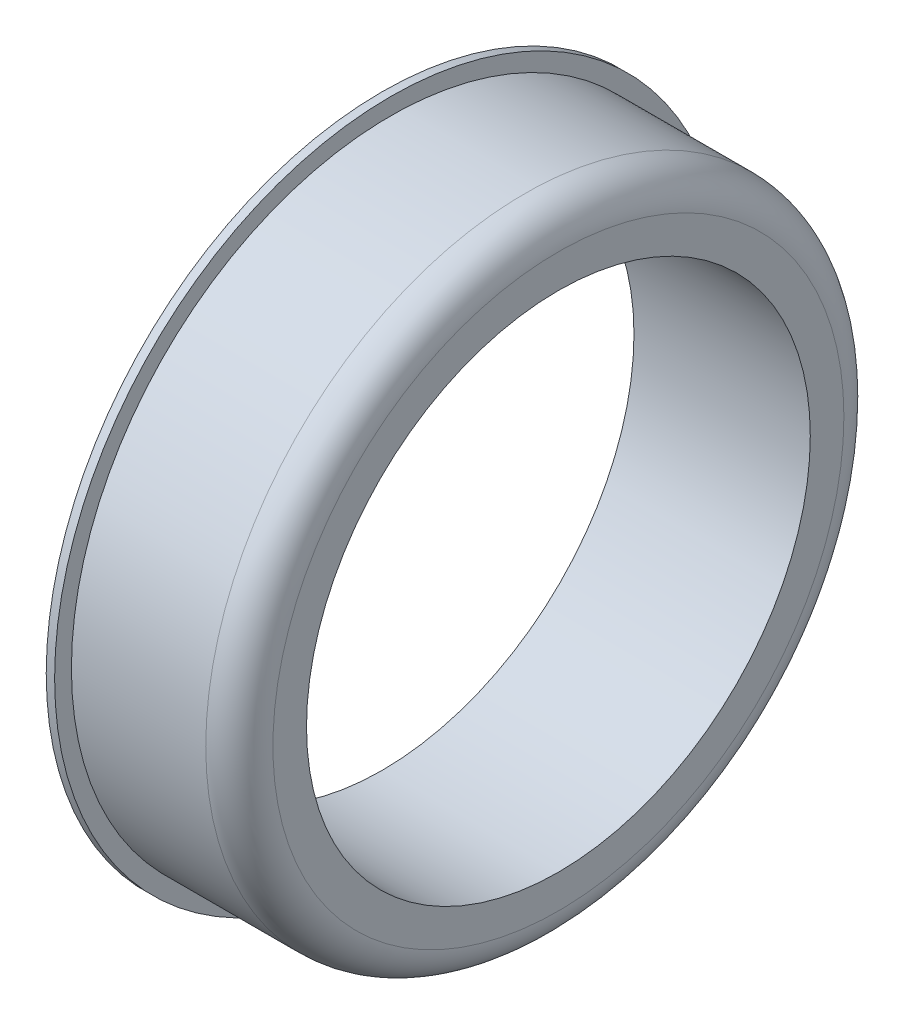
ISO-10303-21;
HEADER;
FILE_DESCRIPTION(('STEP AP214'),'2;1');
FILE_NAME('part.step','',(''),(''),'','','');
FILE_SCHEMA(('AUTOMOTIVE_DESIGN { 1 0 10303 214 1 1 1 1 }'));
ENDSEC;
DATA;
#1=APPLICATION_CONTEXT('core data for automotive mechanical design processes');
#2=APPLICATION_PROTOCOL_DEFINITION('international standard','automotive_design',2000,#1);
#3=PRODUCT_CONTEXT('',#1,'mechanical');
#4=PRODUCT('Part','Part','',(#3));
#5=PRODUCT_RELATED_PRODUCT_CATEGORY('part','',(#4));
#6=PRODUCT_DEFINITION_FORMATION('','',#4);
#7=PRODUCT_DEFINITION_CONTEXT('part definition',#1,'design');
#8=PRODUCT_DEFINITION('design','',#6,#7);
#9=PRODUCT_DEFINITION_SHAPE('','',#8);
#10=(LENGTH_UNIT() NAMED_UNIT(*) SI_UNIT(.MILLI.,.METRE.));
#11=(NAMED_UNIT(*) PLANE_ANGLE_UNIT() SI_UNIT($,.RADIAN.));
#12=(NAMED_UNIT(*) SI_UNIT($,.STERADIAN.) SOLID_ANGLE_UNIT());
#13=UNCERTAINTY_MEASURE_WITH_UNIT(LENGTH_MEASURE(1.E-05),#10,'distance_accuracy_value','');
#14=(GEOMETRIC_REPRESENTATION_CONTEXT(3) GLOBAL_UNCERTAINTY_ASSIGNED_CONTEXT((#13)) GLOBAL_UNIT_ASSIGNED_CONTEXT((#10,
#11,#12)) REPRESENTATION_CONTEXT('',''));
#15=CARTESIAN_POINT('',(0.,0.,0.));
#16=DIRECTION('',(0.,0.,1.));
#17=DIRECTION('',(1.,0.,0.));
#18=AXIS2_PLACEMENT_3D('',#15,#16,#17);
#19=CARTESIAN_POINT('',(0.25,0.,0.));
#20=DIRECTION('',(1.,0.,0.));
#21=DIRECTION('',(0.,0.,-1.));
#22=AXIS2_PLACEMENT_3D('',#19,#20,#21);
#23=PLANE('',#22);
#24=CARTESIAN_POINT('',(0.25,0.,0.));
#25=DIRECTION('',(1.,0.,0.));
#26=DIRECTION('',(0.,0.,-1.));
#27=AXIS2_PLACEMENT_3D('',#24,#25,#26);
#28=CIRCLE('',#27,10.);
#29=CARTESIAN_POINT('',(0.25,0.,-10.));
#30=VERTEX_POINT('',#29);
#31=EDGE_CURVE('E41',#30,#30,#28,.T.);
#32=ORIENTED_EDGE('',*,*,#31,.T.);
#33=EDGE_LOOP('',(#32));
#34=FACE_BOUND('',#33,.T.);
#35=CARTESIAN_POINT('',(0.25,0.,0.));
#36=DIRECTION('',(1.,0.,0.));
#37=DIRECTION('',(0.,0.,-1.));
#38=AXIS2_PLACEMENT_3D('',#35,#36,#37);
#39=CIRCLE('',#38,9.5);
#40=CARTESIAN_POINT('',(0.25,0.,-9.5));
#41=VERTEX_POINT('',#40);
#42=EDGE_CURVE('E53',#41,#41,#39,.T.);
#43=ORIENTED_EDGE('',*,*,#42,.F.);
#44=EDGE_LOOP('',(#43));
#45=FACE_BOUND('',#44,.T.);
#46=ADVANCED_FACE('F30',(#34,#45),#23,.T.);
#47=CARTESIAN_POINT('',(0.,0.,0.));
#48=DIRECTION('',(1.,0.,0.));
#49=DIRECTION('',(0.,0.,-1.));
#50=AXIS2_PLACEMENT_3D('',#47,#48,#49);
#51=PLANE('',#50);
#52=CARTESIAN_POINT('',(0.,0.,0.));
#53=DIRECTION('',(1.,0.,0.));
#54=DIRECTION('',(0.,0.,-1.));
#55=AXIS2_PLACEMENT_3D('',#52,#53,#54);
#56=CIRCLE('',#55,10.);
#57=CARTESIAN_POINT('',(0.,0.,-10.));
#58=VERTEX_POINT('',#57);
#59=EDGE_CURVE('E45',#58,#58,#56,.T.);
#60=ORIENTED_EDGE('',*,*,#59,.F.);
#61=EDGE_LOOP('',(#60));
#62=FACE_BOUND('',#61,.T.);
#63=CARTESIAN_POINT('',(0.,0.,0.));
#64=DIRECTION('',(1.,0.,0.));
#65=DIRECTION('',(0.,0.,-1.));
#66=AXIS2_PLACEMENT_3D('',#63,#64,#65);
#67=CIRCLE('',#66,7.5);
#68=CARTESIAN_POINT('',(0.,0.,-7.5));
#69=VERTEX_POINT('',#68);
#70=EDGE_CURVE('E49',#69,#69,#67,.T.);
#71=ORIENTED_EDGE('',*,*,#70,.T.);
#72=EDGE_LOOP('',(#71));
#73=FACE_BOUND('',#72,.T.);
#74=ADVANCED_FACE('F75',(#62,#73),#51,.F.);
#75=CARTESIAN_POINT('',(0.25,0.,0.));
#76=DIRECTION('',(-1.,0.,0.));
#77=DIRECTION('',(0.,0.,1.));
#78=AXIS2_PLACEMENT_3D('',#75,#76,#77);
#79=CYLINDRICAL_SURFACE('',#78,10.);
#80=ORIENTED_EDGE('',*,*,#31,.F.);
#81=EDGE_LOOP('',(#80));
#82=FACE_BOUND('',#81,.T.);
#83=ORIENTED_EDGE('',*,*,#59,.T.);
#84=EDGE_LOOP('',(#83));
#85=FACE_BOUND('',#84,.T.);
#86=ADVANCED_FACE('F71',(#82,#85),#79,.T.);
#87=CARTESIAN_POINT('',(0.25,0.,0.));
#88=DIRECTION('',(-1.,0.,0.));
#89=DIRECTION('',(0.,0.,1.));
#90=AXIS2_PLACEMENT_3D('',#87,#88,#89);
#91=CYLINDRICAL_SURFACE('',#90,7.5);
#92=ORIENTED_EDGE('',*,*,#70,.F.);
#93=EDGE_LOOP('',(#92));
#94=FACE_BOUND('',#93,.T.);
#95=CARTESIAN_POINT('',(5.25,0.,0.));
#96=DIRECTION('',(1.,0.,0.));
#97=DIRECTION('',(0.,0.,-1.));
#98=AXIS2_PLACEMENT_3D('',#95,#96,#97);
#99=CIRCLE('',#98,7.5);
#100=CARTESIAN_POINT('',(5.25,0.,-7.5));
#101=VERTEX_POINT('',#100);
#102=EDGE_CURVE('E56',#101,#101,#99,.T.);
#103=ORIENTED_EDGE('',*,*,#102,.T.);
#104=EDGE_LOOP('',(#103));
#105=FACE_BOUND('',#104,.T.);
#106=ADVANCED_FACE('F60',(#94,#105),#91,.F.);
#107=CARTESIAN_POINT('',(5.25,0.,0.));
#108=DIRECTION('',(1.,0.,0.));
#109=DIRECTION('',(0.,0.,-1.));
#110=AXIS2_PLACEMENT_3D('',#107,#108,#109);
#111=PLANE('',#110);
#112=CARTESIAN_POINT('',(5.25,0.,0.));
#113=DIRECTION('',(1.,0.,0.));
#114=DIRECTION('',(0.,0.,-1.));
#115=AXIS2_PLACEMENT_3D('',#112,#113,#114);
#116=CIRCLE('',#115,8.5);
#117=CARTESIAN_POINT('',(5.25,0.,-8.5));
#118=VERTEX_POINT('',#117);
#119=EDGE_CURVE('E37',#118,#118,#116,.T.);
#120=ORIENTED_EDGE('',*,*,#119,.T.);
#121=EDGE_LOOP('',(#120));
#122=FACE_BOUND('',#121,.T.);
#123=ORIENTED_EDGE('',*,*,#102,.F.);
#124=EDGE_LOOP('',(#123));
#125=FACE_BOUND('',#124,.T.);
#126=ADVANCED_FACE('F62',(#122,#125),#111,.T.);
#127=CARTESIAN_POINT('',(5.25,0.,0.));
#128=DIRECTION('',(-1.,0.,0.));
#129=DIRECTION('',(0.,0.,1.));
#130=AXIS2_PLACEMENT_3D('',#127,#128,#129);
#131=CYLINDRICAL_SURFACE('',#130,9.5);
#132=CARTESIAN_POINT('',(4.25,0.,0.));
#133=DIRECTION('',(1.,0.,0.));
#134=DIRECTION('',(0.,0.,-1.));
#135=AXIS2_PLACEMENT_3D('',#132,#133,#134);
#136=CIRCLE('',#135,9.5);
#137=CARTESIAN_POINT('',(4.25,0.,-9.5));
#138=VERTEX_POINT('',#137);
#139=EDGE_CURVE('E10',#138,#138,#136,.F.);
#140=ORIENTED_EDGE('',*,*,#139,.T.);
#141=EDGE_LOOP('',(#140));
#142=FACE_BOUND('',#141,.T.);
#143=ORIENTED_EDGE('',*,*,#42,.T.);
#144=EDGE_LOOP('',(#143));
#145=FACE_BOUND('',#144,.T.);
#146=ADVANCED_FACE('F64',(#142,#145),#131,.T.);
#147=CARTESIAN_POINT('',(4.25,0.,0.));
#148=DIRECTION('',(1.,0.,0.));
#149=DIRECTION('',(0.,0.,-1.));
#150=AXIS2_PLACEMENT_3D('',#147,#148,#149);
#151=TOROIDAL_SURFACE('',#150,8.5,1.);
#152=ORIENTED_EDGE('',*,*,#139,.F.);
#153=EDGE_LOOP('',(#152));
#154=FACE_BOUND('',#153,.T.);
#155=ORIENTED_EDGE('',*,*,#119,.F.);
#156=EDGE_LOOP('',(#155));
#157=FACE_BOUND('',#156,.T.);
#158=ADVANCED_FACE('F32',(#154,#157),#151,.T.);
#159=CLOSED_SHELL('',(#46,#74,#86,#106,#126,#146,#158));
#160=MANIFOLD_SOLID_BREP('B2',#159);
#161=ADVANCED_BREP_SHAPE_REPRESENTATION('',(#18,#160),#14);
#162=SHAPE_DEFINITION_REPRESENTATION(#9,#161);
ENDSEC;
END-ISO-10303-21;
